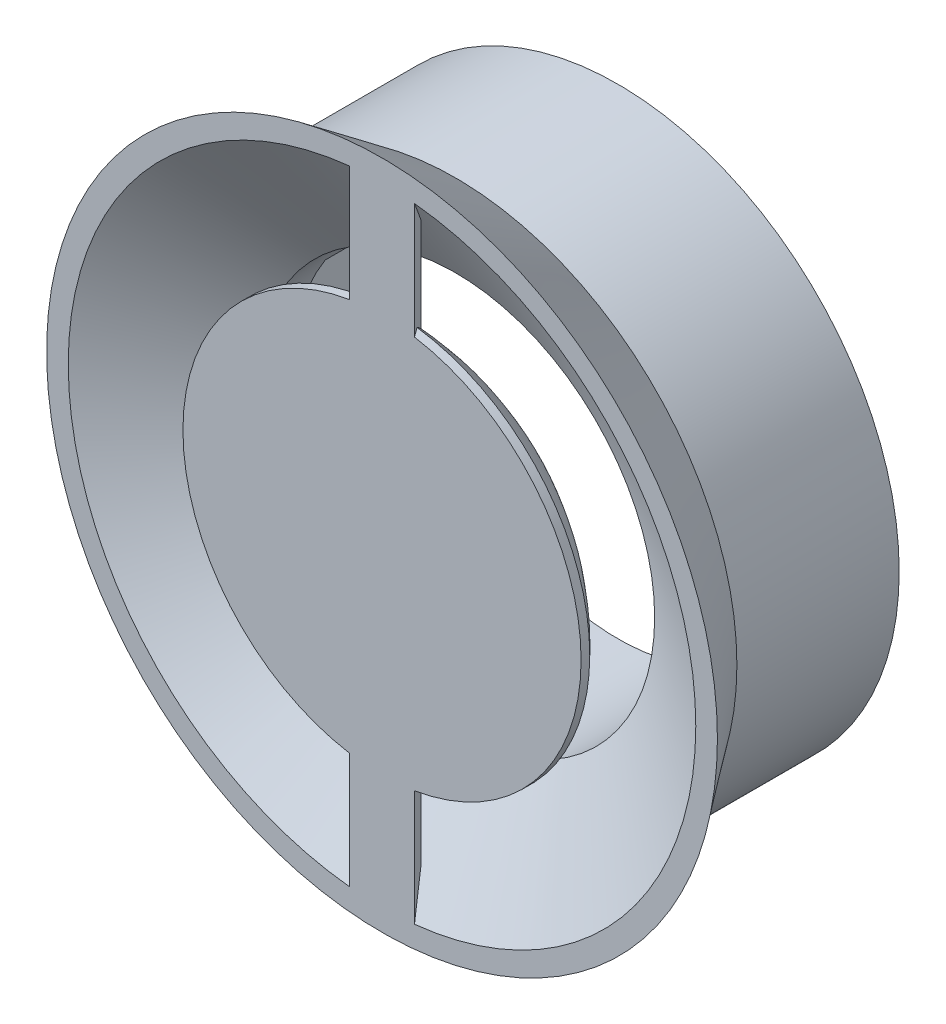
ISO-10303-21;
HEADER;
FILE_DESCRIPTION(('STEP AP214'),'2;1');
FILE_NAME('part.step','',(''),(''),'','','');
FILE_SCHEMA(('AUTOMOTIVE_DESIGN { 1 0 10303 214 1 1 1 1 }'));
ENDSEC;
DATA;
#1=APPLICATION_CONTEXT('core data for automotive mechanical design processes');
#2=APPLICATION_PROTOCOL_DEFINITION('international standard','automotive_design',2000,#1);
#3=PRODUCT_CONTEXT('',#1,'mechanical');
#4=PRODUCT('Part','Part','',(#3));
#5=PRODUCT_RELATED_PRODUCT_CATEGORY('part','',(#4));
#6=PRODUCT_DEFINITION_FORMATION('','',#4);
#7=PRODUCT_DEFINITION_CONTEXT('part definition',#1,'design');
#8=PRODUCT_DEFINITION('design','',#6,#7);
#9=PRODUCT_DEFINITION_SHAPE('','',#8);
#10=(LENGTH_UNIT() NAMED_UNIT(*) SI_UNIT(.MILLI.,.METRE.));
#11=(NAMED_UNIT(*) PLANE_ANGLE_UNIT() SI_UNIT($,.RADIAN.));
#12=(NAMED_UNIT(*) SI_UNIT($,.STERADIAN.) SOLID_ANGLE_UNIT());
#13=UNCERTAINTY_MEASURE_WITH_UNIT(LENGTH_MEASURE(1.E-05),#10,'distance_accuracy_value','');
#14=(GEOMETRIC_REPRESENTATION_CONTEXT(3) GLOBAL_UNCERTAINTY_ASSIGNED_CONTEXT((#13)) GLOBAL_UNIT_ASSIGNED_CONTEXT((#10,
#11,#12)) REPRESENTATION_CONTEXT('',''));
#15=CARTESIAN_POINT('',(0.,0.,0.));
#16=DIRECTION('',(0.,0.,1.));
#17=DIRECTION('',(1.,0.,0.));
#18=AXIS2_PLACEMENT_3D('',#15,#16,#17);
#19=CARTESIAN_POINT('',(-7.5,77.1362431027076,25.4999999999969));
#20=DIRECTION('',(-0.819152044288991,0.,-0.573576436351046));
#21=DIRECTION('',(-0.573576436351046,0.,0.819152044288991));
#22=AXIS2_PLACEMENT_3D('',#19,#20,#21);
#23=PLANE('',#22);
#24=CARTESIAN_POINT('',(-24.2492896325431,0.,49.4204646030597));
#25=DIRECTION('',(-0.819152044288991,0.,-0.573576436351046));
#26=DIRECTION('',(-0.573576436351046,0.,0.819152044288991));
#27=AXIS2_PLACEMENT_3D('',#24,#25,#26);
#28=CIRCLE('',#27,55.4984443928043);
#29=CARTESIAN_POINT('',(-6.09958492358058,45.5938051028868,23.4999999999969));
#30=VERTEX_POINT('',#29);
#31=CARTESIAN_POINT('',(-3.99896230895145,42.8206527326661,20.4999999999969));
#32=VERTEX_POINT('',#31);
#33=EDGE_CURVE('E80',#30,#32,#28,.T.);
#34=ORIENTED_EDGE('',*,*,#33,.F.);
#35=CARTESIAN_POINT('',(0.,0.,14.7888899494311));
#36=DIRECTION('',(-0.819152044288991,0.,-0.573576436351046));
#37=DIRECTION('',(0.573576436351046,0.,-0.819152044288991));
#38=AXIS2_PLACEMENT_3D('',#35,#36,#37);
#39=ELLIPSE('',#38,80.1985525985704,46.);
#40=CARTESIAN_POINT('',(-7.5,45.3844687090198,25.4999999999969));
#41=VERTEX_POINT('',#40);
#42=EDGE_CURVE('E321',#30,#41,#39,.F.);
#43=ORIENTED_EDGE('',*,*,#42,.T.);
#44=DIRECTION('',(0.,-1.,0.));
#45=VECTOR('',#44,1.);
#46=CARTESIAN_POINT('',(-7.5,77.1362431027076,25.4999999999969));
#47=LINE('',#46,#45);
#48=CARTESIAN_POINT('',(-7.5,72.111025509275,25.4999999999969));
#49=VERTEX_POINT('',#48);
#50=EDGE_CURVE('E226',#49,#41,#47,.T.);
#51=ORIENTED_EDGE('',*,*,#50,.F.);
#52=CARTESIAN_POINT('',(-3.99882226744381,64.5818882166036,20.4997999999969));
#53=CARTESIAN_POINT('',(-4.28912297352715,65.2114236041238,20.9143923747457));
#54=CARTESIAN_POINT('',(-4.57983085245989,65.8403878989989,21.3295662525877));
#55=CARTESIAN_POINT('',(-5.16200171211926,67.0972494760597,22.1609924053936));
#56=CARTESIAN_POINT('',(-5.4534646899754,67.7251467622865,22.5772446762579));
#57=CARTESIAN_POINT('',(-6.03708854093841,68.9799539128103,23.4107459156979));
#58=CARTESIAN_POINT('',(-6.32924941364474,69.6068637776735,23.8279948837015));
#59=CARTESIAN_POINT('',(-6.91422047677172,70.8597660099791,24.6634201415081));
#60=CARTESIAN_POINT('',(-7.20703066965231,71.4857583739305,25.0815964348243));
#61=CARTESIAN_POINT('',(-7.50014004150764,72.111324390394,25.5001999999969));
#62=B_SPLINE_CURVE_WITH_KNOTS('',3,(#52,#53,#54,#55,#56,#57,#58,#59,#60,#61),.UNSPECIFIED.,.F.,
.F.,(4,2,2,2,4),(0.,2.42327892782222,4.84654865706109,7.2698169958418,9.69309453084609),.UNSPECIFIED.);
#63=CARTESIAN_POINT('',(-3.99896230895145,64.5821919070856,20.4999999999969));
#64=VERTEX_POINT('',#63);
#65=EDGE_CURVE('E356',#64,#49,#62,.T.);
#66=ORIENTED_EDGE('',*,*,#65,.F.);
#67=DIRECTION('',(0.,-1.,0.));
#68=VECTOR('',#67,1.);
#69=CARTESIAN_POINT('',(-3.99896230895145,77.1362431027076,20.4999999999969));
#70=LINE('',#69,#68);
#71=EDGE_CURVE('E199',#64,#32,#70,.T.);
#72=ORIENTED_EDGE('',*,*,#71,.T.);
#73=EDGE_LOOP('',(#34,#43,#51,#66,#72));
#74=FACE_BOUND('',#73,.T.);
#75=ADVANCED_FACE('F63',(#74),#23,.T.);
#76=CARTESIAN_POINT('',(-3.99896230895145,-42.8206527326661,20.4999999999969));
#77=VERTEX_POINT('',#76);
#78=CARTESIAN_POINT('',(-6.09958492358058,-45.5938051028868,23.4999999999969));
#79=VERTEX_POINT('',#78);
#80=EDGE_CURVE('E202',#77,#79,#28,.T.);
#81=ORIENTED_EDGE('',*,*,#80,.F.);
#82=CARTESIAN_POINT('',(-3.99896230895145,-64.5821919070856,20.4999999999969));
#83=VERTEX_POINT('',#82);
#84=EDGE_CURVE('E190',#77,#83,#70,.T.);
#85=ORIENTED_EDGE('',*,*,#84,.T.);
#86=CARTESIAN_POINT('',(-7.50014004150764,-72.111324390394,25.5001999999969));
#87=CARTESIAN_POINT('',(-7.20703066965231,-71.4857583739305,25.0815964348243));
#88=CARTESIAN_POINT('',(-6.91422047677172,-70.8597660099791,24.6634201415081));
#89=CARTESIAN_POINT('',(-6.32924941364474,-69.6068637776735,23.8279948837015));
#90=CARTESIAN_POINT('',(-6.03708854093841,-68.9799539128103,23.4107459156979));
#91=CARTESIAN_POINT('',(-5.4534646899754,-67.7251467622865,22.5772446762579));
#92=CARTESIAN_POINT('',(-5.16200171211926,-67.0972494760597,22.1609924053936));
#93=CARTESIAN_POINT('',(-4.57983085245989,-65.8403878989989,21.3295662525877));
#94=CARTESIAN_POINT('',(-4.28912297352715,-65.2114236041238,20.9143923747457));
#95=CARTESIAN_POINT('',(-3.9988222674438,-64.5818882166036,20.4997999999969));
#96=B_SPLINE_CURVE_WITH_KNOTS('',3,(#86,#87,#88,#89,#90,#91,#92,#93,#94,#95),.UNSPECIFIED.,.F.,
.F.,(4,2,2,2,4),(0.,2.42327753500429,4.846545873785,7.26981560302387,9.6930945308461),.UNSPECIFIED.);
#97=CARTESIAN_POINT('',(-7.49999992897657,-72.1110248264051,25.5));
#98=VERTEX_POINT('',#97);
#99=EDGE_CURVE('E214',#98,#83,#96,.T.);
#100=ORIENTED_EDGE('',*,*,#99,.F.);
#101=CARTESIAN_POINT('',(-7.5,-45.3844687090198,25.4999999999969));
#102=VERTEX_POINT('',#101);
#103=EDGE_CURVE('E67',#102,#98,#47,.T.);
#104=ORIENTED_EDGE('',*,*,#103,.F.);
#105=EDGE_CURVE('E88',#102,#79,#39,.F.);
#106=ORIENTED_EDGE('',*,*,#105,.T.);
#107=EDGE_LOOP('',(#81,#85,#100,#104,#106));
#108=FACE_BOUND('',#107,.T.);
#109=ADVANCED_FACE('F203',(#108),#23,.T.);
#110=CARTESIAN_POINT('',(7.5,77.1362431027076,25.4999999999969));
#111=DIRECTION('',(0.819152044288991,0.,-0.573576436351046));
#112=DIRECTION('',(-0.573576436351046,0.,-0.819152044288991));
#113=AXIS2_PLACEMENT_3D('',#110,#111,#112);
#114=PLANE('',#113);
#115=CARTESIAN_POINT('',(24.2492896325431,0.,49.4204646030597));
#116=DIRECTION('',(0.819152044288991,0.,-0.573576436351046));
#117=DIRECTION('',(-0.573576436351046,0.,-0.819152044288991));
#118=AXIS2_PLACEMENT_3D('',#115,#116,#117);
#119=CIRCLE('',#118,55.4984443928043);
#120=CARTESIAN_POINT('',(6.09958492358058,-45.5938051028868,23.4999999999969));
#121=VERTEX_POINT('',#120);
#122=CARTESIAN_POINT('',(3.99896230895145,-42.8206527326661,20.4999999999969));
#123=VERTEX_POINT('',#122);
#124=EDGE_CURVE('E208',#121,#123,#119,.T.);
#125=ORIENTED_EDGE('',*,*,#124,.F.);
#126=CARTESIAN_POINT('',(0.,0.,14.7888899494311));
#127=DIRECTION('',(0.819152044288991,0.,-0.573576436351046));
#128=DIRECTION('',(-0.573576436351046,0.,-0.819152044288991));
#129=AXIS2_PLACEMENT_3D('',#126,#127,#128);
#130=ELLIPSE('',#129,80.1985525985704,46.);
#131=CARTESIAN_POINT('',(7.5,-45.3844687090198,25.4999999999969));
#132=VERTEX_POINT('',#131);
#133=EDGE_CURVE('E13',#121,#132,#130,.F.);
#134=ORIENTED_EDGE('',*,*,#133,.T.);
#135=DIRECTION('',(0.,1.,0.));
#136=VECTOR('',#135,1.);
#137=CARTESIAN_POINT('',(7.5,77.1362431027076,25.4999999999969));
#138=LINE('',#137,#136);
#139=CARTESIAN_POINT('',(7.5,-72.111025509275,25.4999999999969));
#140=VERTEX_POINT('',#139);
#141=EDGE_CURVE('E200',#140,#132,#138,.T.);
#142=ORIENTED_EDGE('',*,*,#141,.F.);
#143=CARTESIAN_POINT('',(3.99882226744381,-64.5818882166036,20.4997999999969));
#144=CARTESIAN_POINT('',(4.28912297352715,-65.2114236041238,20.9143923747457));
#145=CARTESIAN_POINT('',(4.57983085245989,-65.8403878989989,21.3295662525877));
#146=CARTESIAN_POINT('',(5.16200171211926,-67.0972494760597,22.1609924053936));
#147=CARTESIAN_POINT('',(5.4534646899754,-67.7251467622865,22.5772446762579));
#148=CARTESIAN_POINT('',(6.03708854093841,-68.9799539128103,23.4107459156979));
#149=CARTESIAN_POINT('',(6.32924941364474,-69.6068637776735,23.8279948837015));
#150=CARTESIAN_POINT('',(6.91422047677172,-70.8597660099791,24.6634201415081));
#151=CARTESIAN_POINT('',(7.20703066965231,-71.4857583739305,25.0815964348243));
#152=CARTESIAN_POINT('',(7.50014004150764,-72.111324390394,25.5001999999969));
#153=B_SPLINE_CURVE_WITH_KNOTS('',3,(#143,#144,#145,#146,#147,#148,#149,#150,#151,#152),
.UNSPECIFIED.,.F.,.F.,(4,2,2,2,4),(0.,2.42327892782222,4.84654865706109,7.2698169958418,
9.69309453084609),.UNSPECIFIED.);
#154=CARTESIAN_POINT('',(3.99896230895145,-64.5821919070856,20.4999999999969));
#155=VERTEX_POINT('',#154);
#156=EDGE_CURVE('E217',#155,#140,#153,.T.);
#157=ORIENTED_EDGE('',*,*,#156,.F.);
#158=DIRECTION('',(0.,1.,0.));
#159=VECTOR('',#158,1.);
#160=CARTESIAN_POINT('',(3.99896230895145,77.1362431027076,20.4999999999969));
#161=LINE('',#160,#159);
#162=EDGE_CURVE('E467',#155,#123,#161,.T.);
#163=ORIENTED_EDGE('',*,*,#162,.T.);
#164=EDGE_LOOP('',(#125,#134,#142,#157,#163));
#165=FACE_BOUND('',#164,.T.);
#166=ADVANCED_FACE('F260',(#165),#114,.T.);
#167=CARTESIAN_POINT('',(3.99896230895145,42.8206527326661,20.4999999999969));
#168=VERTEX_POINT('',#167);
#169=CARTESIAN_POINT('',(6.09958492358058,45.5938051028868,23.4999999999969));
#170=VERTEX_POINT('',#169);
#171=EDGE_CURVE('E207',#168,#170,#119,.T.);
#172=ORIENTED_EDGE('',*,*,#171,.F.);
#173=CARTESIAN_POINT('',(3.99896230895145,64.5821919070856,20.4999999999969));
#174=VERTEX_POINT('',#173);
#175=EDGE_CURVE('E466',#168,#174,#161,.T.);
#176=ORIENTED_EDGE('',*,*,#175,.T.);
#177=CARTESIAN_POINT('',(7.50014004150764,72.111324390394,25.5001999999969));
#178=CARTESIAN_POINT('',(7.20703066965231,71.4857583739305,25.0815964348243));
#179=CARTESIAN_POINT('',(6.91422047677172,70.8597660099791,24.6634201415081));
#180=CARTESIAN_POINT('',(6.32924941364474,69.6068637776735,23.8279948837015));
#181=CARTESIAN_POINT('',(6.03708854093841,68.9799539128103,23.4107459156979));
#182=CARTESIAN_POINT('',(5.4534646899754,67.7251467622865,22.5772446762579));
#183=CARTESIAN_POINT('',(5.16200171211926,67.0972494760597,22.1609924053936));
#184=CARTESIAN_POINT('',(4.57983085245989,65.8403878989989,21.3295662525877));
#185=CARTESIAN_POINT('',(4.28912297352715,65.2114236041238,20.9143923747457));
#186=CARTESIAN_POINT('',(3.9988222674438,64.5818882166036,20.4997999999969));
#187=B_SPLINE_CURVE_WITH_KNOTS('',3,(#177,#178,#179,#180,#181,#182,#183,#184,#185,#186),
.UNSPECIFIED.,.F.,.F.,(4,2,2,2,4),(0.,2.42327753500429,4.846545873785,7.26981560302387,
9.6930945308461),.UNSPECIFIED.);
#188=CARTESIAN_POINT('',(7.49999991921302,72.1110247325363,25.5));
#189=VERTEX_POINT('',#188);
#190=EDGE_CURVE('E360',#189,#174,#187,.T.);
#191=ORIENTED_EDGE('',*,*,#190,.F.);
#192=CARTESIAN_POINT('',(7.5,45.3844687090198,25.4999999999969));
#193=VERTEX_POINT('',#192);
#194=EDGE_CURVE('E224',#193,#189,#138,.T.);
#195=ORIENTED_EDGE('',*,*,#194,.F.);
#196=EDGE_CURVE('E73',#193,#170,#130,.F.);
#197=ORIENTED_EDGE('',*,*,#196,.T.);
#198=EDGE_LOOP('',(#172,#176,#191,#195,#197));
#199=FACE_BOUND('',#198,.T.);
#200=ADVANCED_FACE('F460',(#199),#114,.T.);
#201=CARTESIAN_POINT('',(0.,0.,20.4999999999969));
#202=DIRECTION('',(0.,0.,-1.));
#203=DIRECTION('',(-1.,0.,0.));
#204=AXIS2_PLACEMENT_3D('',#201,#202,#203);
#205=PLANE('',#204);
#206=CARTESIAN_POINT('',(0.,0.,20.4999999999969));
#207=DIRECTION('',(0.,0.,-1.));
#208=DIRECTION('',(-1.,0.,0.));
#209=AXIS2_PLACEMENT_3D('',#206,#207,#208);
#210=CIRCLE('',#209,43.00697617829);
#211=EDGE_CURVE('E213',#32,#168,#210,.T.);
#212=ORIENTED_EDGE('',*,*,#211,.F.);
#213=ORIENTED_EDGE('',*,*,#71,.F.);
#214=CARTESIAN_POINT('',(0.,0.,20.4999999999969));
#215=DIRECTION('',(0.,0.,-1.));
#216=DIRECTION('',(-1.,0.,0.));
#217=AXIS2_PLACEMENT_3D('',#214,#215,#216);
#218=CIRCLE('',#217,64.7058823529364);
#219=EDGE_CURVE('E358',#174,#64,#218,.F.);
#220=ORIENTED_EDGE('',*,*,#219,.F.);
#221=ORIENTED_EDGE('',*,*,#175,.F.);
#222=EDGE_LOOP('',(#212,#213,#220,#221));
#223=FACE_BOUND('',#222,.T.);
#224=ADVANCED_FACE('F307',(#223),#205,.T.);
#225=CARTESIAN_POINT('',(0.,0.,-29.));
#226=DIRECTION('',(0.,0.,1.));
#227=DIRECTION('',(1.,0.,0.));
#228=AXIS2_PLACEMENT_3D('',#225,#226,#227);
#229=PLANE('',#228);
#230=CARTESIAN_POINT('',(0.,0.,-29.));
#231=DIRECTION('',(0.,0.,-1.));
#232=DIRECTION('',(-1.,0.,0.));
#233=AXIS2_PLACEMENT_3D('',#230,#231,#232);
#234=CIRCLE('',#233,46.);
#235=CARTESIAN_POINT('',(38.6134691526156,-25.,-29.));
#236=VERTEX_POINT('',#235);
#237=CARTESIAN_POINT('',(-38.6134691526156,-25.,-29.));
#238=VERTEX_POINT('',#237);
#239=EDGE_CURVE('E500',#236,#238,#234,.T.);
#240=ORIENTED_EDGE('',*,*,#239,.F.);
#241=DIRECTION('',(-1.,0.,0.));
#242=VECTOR('',#241,1.);
#243=CARTESIAN_POINT('',(55.,-25.,-29.));
#244=LINE('',#243,#242);
#245=CARTESIAN_POINT('',(55.,-25.,-29.));
#246=VERTEX_POINT('',#245);
#247=EDGE_CURVE('E477',#246,#236,#244,.T.);
#248=ORIENTED_EDGE('',*,*,#247,.F.);
#249=DIRECTION('',(0.,-1.,0.));
#250=VECTOR('',#249,1.);
#251=CARTESIAN_POINT('',(55.,25.,-29.));
#252=LINE('',#251,#250);
#253=CARTESIAN_POINT('',(55.,25.,-29.));
#254=VERTEX_POINT('',#253);
#255=EDGE_CURVE('E492',#254,#246,#252,.T.);
#256=ORIENTED_EDGE('',*,*,#255,.F.);
#257=DIRECTION('',(1.,0.,0.));
#258=VECTOR('',#257,1.);
#259=CARTESIAN_POINT('',(55.,25.,-29.));
#260=LINE('',#259,#258);
#261=CARTESIAN_POINT('',(38.6134691526157,25.,-29.));
#262=VERTEX_POINT('',#261);
#263=EDGE_CURVE('E489',#262,#254,#260,.T.);
#264=ORIENTED_EDGE('',*,*,#263,.F.);
#265=CARTESIAN_POINT('',(-38.6134691526157,25.,-29.));
#266=VERTEX_POINT('',#265);
#267=EDGE_CURVE('E507',#266,#262,#234,.T.);
#268=ORIENTED_EDGE('',*,*,#267,.F.);
#269=CARTESIAN_POINT('',(-55.,25.,-29.));
#270=VERTEX_POINT('',#269);
#271=EDGE_CURVE('E490',#270,#266,#260,.T.);
#272=ORIENTED_EDGE('',*,*,#271,.F.);
#273=DIRECTION('',(0.,1.,0.));
#274=VECTOR('',#273,1.);
#275=CARTESIAN_POINT('',(-55.,25.,-29.));
#276=LINE('',#275,#274);
#277=CARTESIAN_POINT('',(-55.,-25.,-29.));
#278=VERTEX_POINT('',#277);
#279=EDGE_CURVE('E352',#278,#270,#276,.T.);
#280=ORIENTED_EDGE('',*,*,#279,.F.);
#281=EDGE_CURVE('E495',#238,#278,#244,.T.);
#282=ORIENTED_EDGE('',*,*,#281,.F.);
#283=EDGE_LOOP('',(#240,#248,#256,#264,#268,#272,#280,#282));
#284=FACE_BOUND('',#283,.T.);
#285=CARTESIAN_POINT('',(0.,0.,-29.));
#286=DIRECTION('',(0.,0.,1.));
#287=DIRECTION('',(1.,0.,0.));
#288=AXIS2_PLACEMENT_3D('',#285,#286,#287);
#289=CIRCLE('',#288,65.);
#290=CARTESIAN_POINT('',(65.,0.,-29.));
#291=VERTEX_POINT('',#290);
#292=EDGE_CURVE('E431',#291,#291,#289,.T.);
#293=ORIENTED_EDGE('',*,*,#292,.F.);
#294=EDGE_LOOP('',(#293));
#295=FACE_BOUND('',#294,.T.);
#296=ADVANCED_FACE('F65',(#284,#295),#229,.F.);
#297=CARTESIAN_POINT('',(0.,0.,-29.));
#298=DIRECTION('',(0.,0.,1.));
#299=DIRECTION('',(1.,0.,0.));
#300=AXIS2_PLACEMENT_3D('',#297,#298,#299);
#301=CYLINDRICAL_SURFACE('',#300,65.);
#302=ORIENTED_EDGE('',*,*,#292,.T.);
#303=EDGE_LOOP('',(#302));
#304=FACE_BOUND('',#303,.T.);
#305=CARTESIAN_POINT('',(0.,0.,8.5));
#306=DIRECTION('',(0.,0.,1.));
#307=DIRECTION('',(1.,0.,0.));
#308=AXIS2_PLACEMENT_3D('',#305,#306,#307);
#309=CIRCLE('',#308,65.);
#310=CARTESIAN_POINT('',(65.,0.,8.5));
#311=VERTEX_POINT('',#310);
#312=EDGE_CURVE('E434',#311,#311,#309,.T.);
#313=ORIENTED_EDGE('',*,*,#312,.F.);
#314=EDGE_LOOP('',(#313));
#315=FACE_BOUND('',#314,.T.);
#316=ADVANCED_FACE('F444',(#304,#315),#301,.T.);
#317=CARTESIAN_POINT('',(0.,0.,25.5));
#318=DIRECTION('',(0.,0.,1.));
#319=DIRECTION('',(1.,0.,0.));
#320=AXIS2_PLACEMENT_3D('',#317,#318,#319);
#321=PLANE('',#320);
#322=CARTESIAN_POINT('',(0.,0.,25.4999999999969));
#323=DIRECTION('',(0.,0.,1.));
#324=DIRECTION('',(1.,0.,0.));
#325=AXIS2_PLACEMENT_3D('',#322,#323,#324);
#326=CIRCLE('',#325,46.);
#327=EDGE_CURVE('E324',#41,#102,#326,.T.);
#328=ORIENTED_EDGE('',*,*,#327,.T.);
#329=ORIENTED_EDGE('',*,*,#103,.T.);
#330=CARTESIAN_POINT('',(0.,0.,25.5));
#331=DIRECTION('',(0.,0.,1.));
#332=DIRECTION('',(1.,0.,0.));
#333=AXIS2_PLACEMENT_3D('',#330,#331,#332);
#334=CIRCLE('',#333,72.5);
#335=EDGE_CURVE('E221',#49,#98,#334,.T.);
#336=ORIENTED_EDGE('',*,*,#335,.F.);
#337=ORIENTED_EDGE('',*,*,#50,.T.);
#338=EDGE_LOOP('',(#328,#329,#336,#337));
#339=FACE_BOUND('',#338,.T.);
#340=ORIENTED_EDGE('',*,*,#141,.T.);
#341=EDGE_CURVE('E332',#132,#193,#326,.T.);
#342=ORIENTED_EDGE('',*,*,#341,.T.);
#343=ORIENTED_EDGE('',*,*,#194,.T.);
#344=EDGE_CURVE('E346',#140,#189,#334,.T.);
#345=ORIENTED_EDGE('',*,*,#344,.F.);
#346=EDGE_LOOP('',(#340,#342,#343,#345));
#347=FACE_BOUND('',#346,.T.);
#348=CARTESIAN_POINT('',(0.,0.,25.5));
#349=DIRECTION('',(0.,0.,1.));
#350=DIRECTION('',(1.,0.,0.));
#351=AXIS2_PLACEMENT_3D('',#348,#349,#350);
#352=CIRCLE('',#351,77.5);
#353=CARTESIAN_POINT('',(77.5,0.,25.5));
#354=VERTEX_POINT('',#353);
#355=EDGE_CURVE('E298',#354,#354,#352,.T.);
#356=ORIENTED_EDGE('',*,*,#355,.T.);
#357=EDGE_LOOP('',(#356));
#358=FACE_BOUND('',#357,.T.);
#359=ADVANCED_FACE('F343',(#339,#347,#358),#321,.T.);
#360=CARTESIAN_POINT('',(0.,0.,8.5));
#361=DIRECTION('',(0.,0.,1.));
#362=DIRECTION('',(1.,0.,0.));
#363=AXIS2_PLACEMENT_3D('',#360,#361,#362);
#364=CONICAL_SURFACE('',#363,65.,0.634022719663421);
#365=ORIENTED_EDGE('',*,*,#312,.T.);
#366=EDGE_LOOP('',(#365));
#367=FACE_BOUND('',#366,.T.);
#368=ORIENTED_EDGE('',*,*,#355,.F.);
#369=EDGE_LOOP('',(#368));
#370=FACE_BOUND('',#369,.T.);
#371=ADVANCED_FACE('F397',(#367,#370),#364,.T.);
#372=CARTESIAN_POINT('',(0.,0.,48.5));
#373=DIRECTION('',(0.,0.,-1.));
#374=DIRECTION('',(-1.,0.,0.));
#375=AXIS2_PLACEMENT_3D('',#372,#373,#374);
#376=CYLINDRICAL_SURFACE('',#375,46.);
#377=CARTESIAN_POINT('',(0.,0.,8.49999999999999));
#378=DIRECTION('',(0.,0.,1.));
#379=DIRECTION('',(1.,0.,0.));
#380=AXIS2_PLACEMENT_3D('',#377,#378,#379);
#381=CIRCLE('',#380,46.);
#382=CARTESIAN_POINT('',(46.,0.,8.49999999999999));
#383=VERTEX_POINT('',#382);
#384=EDGE_CURVE('E240',#383,#383,#381,.T.);
#385=ORIENTED_EDGE('',*,*,#384,.T.);
#386=EDGE_LOOP('',(#385));
#387=FACE_BOUND('',#386,.T.);
#388=CARTESIAN_POINT('',(0.,0.,0.));
#389=DIRECTION('',(0.,0.,-1.));
#390=DIRECTION('',(-1.,0.,0.));
#391=AXIS2_PLACEMENT_3D('',#388,#389,#390);
#392=CIRCLE('',#391,46.);
#393=CARTESIAN_POINT('',(38.6134691526156,-25.,0.));
#394=VERTEX_POINT('',#393);
#395=CARTESIAN_POINT('',(38.6134691526157,25.,0.));
#396=VERTEX_POINT('',#395);
#397=EDGE_CURVE('E374',#394,#396,#392,.F.);
#398=ORIENTED_EDGE('',*,*,#397,.F.);
#399=DIRECTION('',(0.,0.,-1.));
#400=VECTOR('',#399,1.);
#401=CARTESIAN_POINT('',(38.6134691526156,-25.,48.5));
#402=LINE('',#401,#400);
#403=EDGE_CURVE('E362',#394,#236,#402,.T.);
#404=ORIENTED_EDGE('',*,*,#403,.T.);
#405=ORIENTED_EDGE('',*,*,#239,.T.);
#406=DIRECTION('',(0.,0.,-1.));
#407=VECTOR('',#406,1.);
#408=CARTESIAN_POINT('',(-38.6134691526156,-25.,48.5));
#409=LINE('',#408,#407);
#410=CARTESIAN_POINT('',(-38.6134691526156,-25.,0.));
#411=VERTEX_POINT('',#410);
#412=EDGE_CURVE('E515',#238,#411,#409,.F.);
#413=ORIENTED_EDGE('',*,*,#412,.T.);
#414=CARTESIAN_POINT('',(-38.6134691526157,25.,0.));
#415=VERTEX_POINT('',#414);
#416=EDGE_CURVE('E442',#415,#411,#392,.F.);
#417=ORIENTED_EDGE('',*,*,#416,.F.);
#418=DIRECTION('',(0.,0.,-1.));
#419=VECTOR('',#418,1.);
#420=CARTESIAN_POINT('',(-38.6134691526156,25.,48.5));
#421=LINE('',#420,#419);
#422=EDGE_CURVE('E510',#415,#266,#421,.T.);
#423=ORIENTED_EDGE('',*,*,#422,.T.);
#424=ORIENTED_EDGE('',*,*,#267,.T.);
#425=DIRECTION('',(0.,0.,-1.));
#426=VECTOR('',#425,1.);
#427=CARTESIAN_POINT('',(38.6134691526156,25.,48.5));
#428=LINE('',#427,#426);
#429=EDGE_CURVE('E366',#262,#396,#428,.F.);
#430=ORIENTED_EDGE('',*,*,#429,.T.);
#431=EDGE_LOOP('',(#398,#404,#405,#413,#417,#423,#424,#430));
#432=FACE_BOUND('',#431,.T.);
#433=ADVANCED_FACE('F386',(#387,#432),#376,.F.);
#434=CARTESIAN_POINT('',(0.,0.,0.));
#435=DIRECTION('',(0.,0.,-1.));
#436=DIRECTION('',(-1.,0.,0.));
#437=AXIS2_PLACEMENT_3D('',#434,#435,#436);
#438=PLANE('',#437);
#439=ORIENTED_EDGE('',*,*,#416,.T.);
#440=DIRECTION('',(-1.,0.,0.));
#441=VECTOR('',#440,1.);
#442=CARTESIAN_POINT('',(55.,-25.,0.));
#443=LINE('',#442,#441);
#444=CARTESIAN_POINT('',(-55.,-25.,0.));
#445=VERTEX_POINT('',#444);
#446=EDGE_CURVE('E483',#411,#445,#443,.T.);
#447=ORIENTED_EDGE('',*,*,#446,.T.);
#448=DIRECTION('',(0.,1.,0.));
#449=VECTOR('',#448,1.);
#450=CARTESIAN_POINT('',(-55.,25.,0.));
#451=LINE('',#450,#449);
#452=CARTESIAN_POINT('',(-55.,25.,0.));
#453=VERTEX_POINT('',#452);
#454=EDGE_CURVE('E472',#445,#453,#451,.T.);
#455=ORIENTED_EDGE('',*,*,#454,.T.);
#456=DIRECTION('',(1.,0.,0.));
#457=VECTOR('',#456,1.);
#458=CARTESIAN_POINT('',(55.,25.,0.));
#459=LINE('',#458,#457);
#460=EDGE_CURVE('E478',#453,#415,#459,.T.);
#461=ORIENTED_EDGE('',*,*,#460,.T.);
#462=EDGE_LOOP('',(#439,#447,#455,#461));
#463=FACE_BOUND('',#462,.T.);
#464=ADVANCED_FACE('F396',(#463),#438,.T.);
#465=CARTESIAN_POINT('',(55.,25.,0.));
#466=DIRECTION('',(0.,1.,0.));
#467=DIRECTION('',(0.,0.,1.));
#468=AXIS2_PLACEMENT_3D('',#465,#466,#467);
#469=PLANE('',#468);
#470=ORIENTED_EDGE('',*,*,#460,.F.);
#471=DIRECTION('',(0.,0.,-1.));
#472=VECTOR('',#471,1.);
#473=CARTESIAN_POINT('',(-55.,25.,0.));
#474=LINE('',#473,#472);
#475=EDGE_CURVE('E486',#453,#270,#474,.T.);
#476=ORIENTED_EDGE('',*,*,#475,.T.);
#477=ORIENTED_EDGE('',*,*,#271,.T.);
#478=ORIENTED_EDGE('',*,*,#422,.F.);
#479=EDGE_LOOP('',(#470,#476,#477,#478));
#480=FACE_BOUND('',#479,.T.);
#481=ADVANCED_FACE('F533',(#480),#469,.F.);
#482=CARTESIAN_POINT('',(55.,-25.,0.));
#483=DIRECTION('',(0.,-1.,0.));
#484=DIRECTION('',(0.,0.,-1.));
#485=AXIS2_PLACEMENT_3D('',#482,#483,#484);
#486=PLANE('',#485);
#487=ORIENTED_EDGE('',*,*,#281,.T.);
#488=DIRECTION('',(0.,0.,-1.));
#489=VECTOR('',#488,1.);
#490=CARTESIAN_POINT('',(-55.,-25.,0.));
#491=LINE('',#490,#489);
#492=EDGE_CURVE('E497',#445,#278,#491,.T.);
#493=ORIENTED_EDGE('',*,*,#492,.F.);
#494=ORIENTED_EDGE('',*,*,#446,.F.);
#495=ORIENTED_EDGE('',*,*,#412,.F.);
#496=EDGE_LOOP('',(#487,#493,#494,#495));
#497=FACE_BOUND('',#496,.T.);
#498=ADVANCED_FACE('F521',(#497),#486,.F.);
#499=CARTESIAN_POINT('',(-55.,25.,0.));
#500=DIRECTION('',(-1.,0.,0.));
#501=DIRECTION('',(0.,-1.,0.));
#502=AXIS2_PLACEMENT_3D('',#499,#500,#501);
#503=PLANE('',#502);
#504=ORIENTED_EDGE('',*,*,#279,.T.);
#505=ORIENTED_EDGE('',*,*,#475,.F.);
#506=ORIENTED_EDGE('',*,*,#454,.F.);
#507=ORIENTED_EDGE('',*,*,#492,.T.);
#508=EDGE_LOOP('',(#504,#505,#506,#507));
#509=FACE_BOUND('',#508,.T.);
#510=ADVANCED_FACE('F398',(#509),#503,.F.);
#511=CARTESIAN_POINT('',(55.,-25.,0.));
#512=VERTEX_POINT('',#511);
#513=EDGE_CURVE('E484',#512,#394,#443,.T.);
#514=ORIENTED_EDGE('',*,*,#513,.F.);
#515=DIRECTION('',(0.,0.,-1.));
#516=VECTOR('',#515,1.);
#517=CARTESIAN_POINT('',(55.,-25.,0.));
#518=LINE('',#517,#516);
#519=EDGE_CURVE('E501',#512,#246,#518,.T.);
#520=ORIENTED_EDGE('',*,*,#519,.T.);
#521=ORIENTED_EDGE('',*,*,#247,.T.);
#522=ORIENTED_EDGE('',*,*,#403,.F.);
#523=EDGE_LOOP('',(#514,#520,#521,#522));
#524=FACE_BOUND('',#523,.T.);
#525=ADVANCED_FACE('F543',(#524),#486,.F.);
#526=ORIENTED_EDGE('',*,*,#263,.T.);
#527=DIRECTION('',(0.,0.,-1.));
#528=VECTOR('',#527,1.);
#529=CARTESIAN_POINT('',(55.,25.,0.));
#530=LINE('',#529,#528);
#531=CARTESIAN_POINT('',(55.,25.,0.));
#532=VERTEX_POINT('',#531);
#533=EDGE_CURVE('E503',#532,#254,#530,.T.);
#534=ORIENTED_EDGE('',*,*,#533,.F.);
#535=EDGE_CURVE('E476',#396,#532,#459,.T.);
#536=ORIENTED_EDGE('',*,*,#535,.F.);
#537=ORIENTED_EDGE('',*,*,#429,.F.);
#538=EDGE_LOOP('',(#526,#534,#536,#537));
#539=FACE_BOUND('',#538,.T.);
#540=ADVANCED_FACE('F538',(#539),#469,.F.);
#541=ORIENTED_EDGE('',*,*,#397,.T.);
#542=ORIENTED_EDGE('',*,*,#535,.T.);
#543=DIRECTION('',(0.,-1.,0.));
#544=VECTOR('',#543,1.);
#545=CARTESIAN_POINT('',(55.,25.,0.));
#546=LINE('',#545,#544);
#547=EDGE_CURVE('E480',#532,#512,#546,.T.);
#548=ORIENTED_EDGE('',*,*,#547,.T.);
#549=ORIENTED_EDGE('',*,*,#513,.T.);
#550=EDGE_LOOP('',(#541,#542,#548,#549));
#551=FACE_BOUND('',#550,.T.);
#552=ADVANCED_FACE('F263',(#551),#438,.T.);
#553=CARTESIAN_POINT('',(55.,25.,0.));
#554=DIRECTION('',(1.,0.,0.));
#555=DIRECTION('',(0.,1.,0.));
#556=AXIS2_PLACEMENT_3D('',#553,#554,#555);
#557=PLANE('',#556);
#558=ORIENTED_EDGE('',*,*,#255,.T.);
#559=ORIENTED_EDGE('',*,*,#519,.F.);
#560=ORIENTED_EDGE('',*,*,#547,.F.);
#561=ORIENTED_EDGE('',*,*,#533,.T.);
#562=EDGE_LOOP('',(#558,#559,#560,#561));
#563=FACE_BOUND('',#562,.T.);
#564=ADVANCED_FACE('F258',(#563),#557,.F.);
#565=CARTESIAN_POINT('',(0.,0.,8.49999999999999));
#566=DIRECTION('',(0.,0.,1.));
#567=DIRECTION('',(1.,0.,0.));
#568=AXIS2_PLACEMENT_3D('',#565,#566,#567);
#569=CONICAL_SURFACE('',#568,46.,1.00041304514495);
#570=ORIENTED_EDGE('',*,*,#335,.T.);
#571=ORIENTED_EDGE('',*,*,#99,.T.);
#572=EDGE_CURVE('E196',#83,#155,#218,.F.);
#573=ORIENTED_EDGE('',*,*,#572,.T.);
#574=ORIENTED_EDGE('',*,*,#156,.T.);
#575=ORIENTED_EDGE('',*,*,#344,.T.);
#576=ORIENTED_EDGE('',*,*,#190,.T.);
#577=ORIENTED_EDGE('',*,*,#219,.T.);
#578=ORIENTED_EDGE('',*,*,#65,.T.);
#579=EDGE_LOOP('',(#570,#571,#573,#574,#575,#576,#577,#578));
#580=FACE_BOUND('',#579,.T.);
#581=ORIENTED_EDGE('',*,*,#384,.F.);
#582=EDGE_LOOP('',(#581));
#583=FACE_BOUND('',#582,.T.);
#584=ADVANCED_FACE('F248',(#580,#583),#569,.F.);
#585=EDGE_CURVE('E194',#123,#77,#210,.T.);
#586=ORIENTED_EDGE('',*,*,#585,.F.);
#587=ORIENTED_EDGE('',*,*,#162,.F.);
#588=ORIENTED_EDGE('',*,*,#572,.F.);
#589=ORIENTED_EDGE('',*,*,#84,.F.);
#590=EDGE_LOOP('',(#586,#587,#588,#589));
#591=FACE_BOUND('',#590,.T.);
#592=ADVANCED_FACE('F191',(#591),#205,.T.);
#593=CARTESIAN_POINT('',(0.,0.,25.4999999999969));
#594=DIRECTION('',(0.,0.,-1.));
#595=DIRECTION('',(-1.,0.,0.));
#596=AXIS2_PLACEMENT_3D('',#593,#594,#595);
#597=CYLINDRICAL_SURFACE('',#596,46.);
#598=ORIENTED_EDGE('',*,*,#42,.F.);
#599=CARTESIAN_POINT('',(0.,0.,23.4999999999969));
#600=DIRECTION('',(0.,0.,1.));
#601=DIRECTION('',(1.,0.,0.));
#602=AXIS2_PLACEMENT_3D('',#599,#600,#601);
#603=CIRCLE('',#602,46.);
#604=EDGE_CURVE('E322',#30,#79,#603,.T.);
#605=ORIENTED_EDGE('',*,*,#604,.T.);
#606=ORIENTED_EDGE('',*,*,#105,.F.);
#607=ORIENTED_EDGE('',*,*,#327,.F.);
#608=EDGE_LOOP('',(#598,#605,#606,#607));
#609=FACE_BOUND('',#608,.T.);
#610=ADVANCED_FACE('F306',(#609),#597,.T.);
#611=CARTESIAN_POINT('',(0.,0.,66.3999999999969));
#612=DIRECTION('',(0.,0.,1.));
#613=DIRECTION('',(1.,0.,0.));
#614=AXIS2_PLACEMENT_3D('',#611,#612,#613);
#615=SPHERICAL_SURFACE('',#614,62.9);
#616=ORIENTED_EDGE('',*,*,#604,.F.);
#617=ORIENTED_EDGE('',*,*,#33,.T.);
#618=ORIENTED_EDGE('',*,*,#211,.T.);
#619=ORIENTED_EDGE('',*,*,#171,.T.);
#620=EDGE_CURVE('E327',#121,#170,#603,.T.);
#621=ORIENTED_EDGE('',*,*,#620,.F.);
#622=ORIENTED_EDGE('',*,*,#124,.T.);
#623=ORIENTED_EDGE('',*,*,#585,.T.);
#624=ORIENTED_EDGE('',*,*,#80,.T.);
#625=EDGE_LOOP('',(#616,#617,#618,#619,#621,#622,#623,#624));
#626=FACE_BOUND('',#625,.T.);
#627=ADVANCED_FACE('F211',(#626),#615,.T.);
#628=ORIENTED_EDGE('',*,*,#133,.F.);
#629=ORIENTED_EDGE('',*,*,#620,.T.);
#630=ORIENTED_EDGE('',*,*,#196,.F.);
#631=ORIENTED_EDGE('',*,*,#341,.F.);
#632=EDGE_LOOP('',(#628,#629,#630,#631));
#633=FACE_BOUND('',#632,.T.);
#634=ADVANCED_FACE('F310',(#633),#597,.T.);
#635=CLOSED_SHELL('',(#75,#109,#166,#200,#224,#296,#316,#359,#371,#433,#464,#481,#498,#510,#525,
#540,#552,#564,#584,#592,#610,#627,#634));
#636=MANIFOLD_SOLID_BREP('B2',#635);
#637=ADVANCED_BREP_SHAPE_REPRESENTATION('',(#18,#636),#14);
#638=SHAPE_DEFINITION_REPRESENTATION(#9,#637);
ENDSEC;
END-ISO-10303-21;
